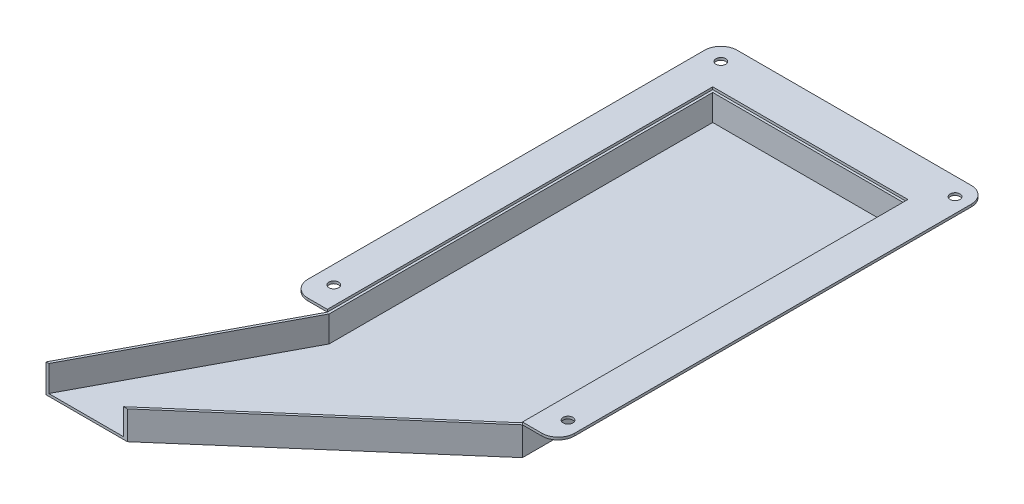
ISO-10303-21;
HEADER;
FILE_DESCRIPTION(('STEP AP214'),'2;1');
FILE_NAME('part.step','',(''),(''),'','','');
FILE_SCHEMA(('AUTOMOTIVE_DESIGN { 1 0 10303 214 1 1 1 1 }'));
ENDSEC;
DATA;
#1=APPLICATION_CONTEXT('core data for automotive mechanical design processes');
#2=APPLICATION_PROTOCOL_DEFINITION('international standard','automotive_design',2000,#1);
#3=PRODUCT_CONTEXT('',#1,'mechanical');
#4=PRODUCT('Part','Part','',(#3));
#5=PRODUCT_RELATED_PRODUCT_CATEGORY('part','',(#4));
#6=PRODUCT_DEFINITION_FORMATION('','',#4);
#7=PRODUCT_DEFINITION_CONTEXT('part definition',#1,'design');
#8=PRODUCT_DEFINITION('design','',#6,#7);
#9=PRODUCT_DEFINITION_SHAPE('','',#8);
#10=(LENGTH_UNIT() NAMED_UNIT(*) SI_UNIT(.MILLI.,.METRE.));
#11=(NAMED_UNIT(*) PLANE_ANGLE_UNIT() SI_UNIT($,.RADIAN.));
#12=(NAMED_UNIT(*) SI_UNIT($,.STERADIAN.) SOLID_ANGLE_UNIT());
#13=UNCERTAINTY_MEASURE_WITH_UNIT(LENGTH_MEASURE(1.E-05),#10,'distance_accuracy_value','');
#14=(GEOMETRIC_REPRESENTATION_CONTEXT(3) GLOBAL_UNCERTAINTY_ASSIGNED_CONTEXT((#13)) GLOBAL_UNIT_ASSIGNED_CONTEXT((#10,
#11,#12)) REPRESENTATION_CONTEXT('',''));
#15=CARTESIAN_POINT('',(0.,0.,0.));
#16=DIRECTION('',(0.,0.,1.));
#17=DIRECTION('',(1.,0.,0.));
#18=AXIS2_PLACEMENT_3D('',#15,#16,#17);
#19=CARTESIAN_POINT('',(0.,19.,0.));
#20=DIRECTION('',(0.,1.,0.));
#21=DIRECTION('',(0.,0.,1.));
#22=AXIS2_PLACEMENT_3D('',#19,#20,#21);
#23=PLANE('',#22);
#24=CARTESIAN_POINT('',(-11.,19.,-15.));
#25=DIRECTION('',(0.,1.,0.));
#26=DIRECTION('',(0.,0.,1.));
#27=AXIS2_PLACEMENT_3D('',#24,#25,#26);
#28=CIRCLE('',#27,3.);
#29=CARTESIAN_POINT('',(-11.,19.,-12.));
#30=VERTEX_POINT('',#29);
#31=EDGE_CURVE('E271',#30,#30,#28,.T.);
#32=ORIENTED_EDGE('',*,*,#31,.F.);
#33=EDGE_LOOP('',(#32));
#34=FACE_BOUND('',#33,.T.);
#35=CARTESIAN_POINT('',(-11.,19.,-253.));
#36=DIRECTION('',(0.,1.,0.));
#37=DIRECTION('',(0.,0.,1.));
#38=AXIS2_PLACEMENT_3D('',#35,#36,#37);
#39=CIRCLE('',#38,3.);
#40=CARTESIAN_POINT('',(-11.,19.,-250.));
#41=VERTEX_POINT('',#40);
#42=EDGE_CURVE('E179',#41,#41,#39,.T.);
#43=ORIENTED_EDGE('',*,*,#42,.F.);
#44=EDGE_LOOP('',(#43));
#45=FACE_BOUND('',#44,.T.);
#46=DIRECTION('',(-1.,0.,0.));
#47=VECTOR('',#46,1.);
#48=CARTESIAN_POINT('',(-22.,19.,-264.));
#49=LINE('',#48,#47);
#50=CARTESIAN_POINT('',(132.,19.,-264.));
#51=VERTEX_POINT('',#50);
#52=CARTESIAN_POINT('',(-12.,19.,-264.));
#53=VERTEX_POINT('',#52);
#54=EDGE_CURVE('E173',#51,#53,#49,.T.);
#55=ORIENTED_EDGE('',*,*,#54,.T.);
#56=CARTESIAN_POINT('',(-12.,19.,-254.));
#57=DIRECTION('',(0.,1.,0.));
#58=DIRECTION('',(0.,0.,1.));
#59=AXIS2_PLACEMENT_3D('',#56,#57,#58);
#60=CIRCLE('',#59,10.);
#61=CARTESIAN_POINT('',(-22.,19.,-254.));
#62=VERTEX_POINT('',#61);
#63=EDGE_CURVE('E222',#53,#62,#60,.T.);
#64=ORIENTED_EDGE('',*,*,#63,.T.);
#65=DIRECTION('',(0.,0.,1.));
#66=VECTOR('',#65,1.);
#67=CARTESIAN_POINT('',(-22.,19.,-264.));
#68=LINE('',#67,#66);
#69=CARTESIAN_POINT('',(-22.,19.,-10.));
#70=VERTEX_POINT('',#69);
#71=EDGE_CURVE('E147',#62,#70,#68,.T.);
#72=ORIENTED_EDGE('',*,*,#71,.T.);
#73=CARTESIAN_POINT('',(-12.,19.,-10.));
#74=DIRECTION('',(0.,1.,0.));
#75=DIRECTION('',(0.,0.,1.));
#76=AXIS2_PLACEMENT_3D('',#73,#74,#75);
#77=CIRCLE('',#76,10.);
#78=CARTESIAN_POINT('',(-12.,19.,0.));
#79=VERTEX_POINT('',#78);
#80=EDGE_CURVE('E144',#70,#79,#77,.T.);
#81=ORIENTED_EDGE('',*,*,#80,.T.);
#82=DIRECTION('',(1.,0.,0.));
#83=VECTOR('',#82,1.);
#84=CARTESIAN_POINT('',(-22.,19.,0.));
#85=LINE('',#84,#83);
#86=CARTESIAN_POINT('',(0.,19.,0.));
#87=VERTEX_POINT('',#86);
#88=EDGE_CURVE('E135',#79,#87,#85,.T.);
#89=ORIENTED_EDGE('',*,*,#88,.T.);
#90=DIRECTION('',(0.,0.,-1.));
#91=VECTOR('',#90,1.);
#92=CARTESIAN_POINT('',(0.,19.,-237.));
#93=LINE('',#92,#91);
#94=CARTESIAN_POINT('',(0.,19.,-237.));
#95=VERTEX_POINT('',#94);
#96=EDGE_CURVE('E140',#87,#95,#93,.T.);
#97=ORIENTED_EDGE('',*,*,#96,.T.);
#98=DIRECTION('',(1.,0.,0.));
#99=VECTOR('',#98,1.);
#100=CARTESIAN_POINT('',(120.,19.,-237.));
#101=LINE('',#100,#99);
#102=CARTESIAN_POINT('',(120.,19.,-237.));
#103=VERTEX_POINT('',#102);
#104=EDGE_CURVE('E162',#95,#103,#101,.T.);
#105=ORIENTED_EDGE('',*,*,#104,.T.);
#106=DIRECTION('',(0.,0.,1.));
#107=VECTOR('',#106,1.);
#108=CARTESIAN_POINT('',(120.,19.,0.));
#109=LINE('',#108,#107);
#110=CARTESIAN_POINT('',(120.,19.,0.));
#111=VERTEX_POINT('',#110);
#112=EDGE_CURVE('E164',#103,#111,#109,.T.);
#113=ORIENTED_EDGE('',*,*,#112,.T.);
#114=DIRECTION('',(1.,0.,0.));
#115=VECTOR('',#114,1.);
#116=CARTESIAN_POINT('',(142.,19.,0.));
#117=LINE('',#116,#115);
#118=CARTESIAN_POINT('',(132.,19.,0.));
#119=VERTEX_POINT('',#118);
#120=EDGE_CURVE('E169',#111,#119,#117,.T.);
#121=ORIENTED_EDGE('',*,*,#120,.T.);
#122=CARTESIAN_POINT('',(132.,19.,-10.));
#123=DIRECTION('',(0.,1.,0.));
#124=DIRECTION('',(0.,0.,1.));
#125=AXIS2_PLACEMENT_3D('',#122,#123,#124);
#126=CIRCLE('',#125,10.);
#127=CARTESIAN_POINT('',(142.,19.,-10.));
#128=VERTEX_POINT('',#127);
#129=EDGE_CURVE('E68',#119,#128,#126,.T.);
#130=ORIENTED_EDGE('',*,*,#129,.T.);
#131=DIRECTION('',(0.,0.,-1.));
#132=VECTOR('',#131,1.);
#133=CARTESIAN_POINT('',(142.,19.,-264.));
#134=LINE('',#133,#132);
#135=CARTESIAN_POINT('',(142.,19.,-254.));
#136=VERTEX_POINT('',#135);
#137=EDGE_CURVE('E171',#128,#136,#134,.T.);
#138=ORIENTED_EDGE('',*,*,#137,.T.);
#139=CARTESIAN_POINT('',(132.,19.,-254.));
#140=DIRECTION('',(0.,1.,0.));
#141=DIRECTION('',(0.,0.,1.));
#142=AXIS2_PLACEMENT_3D('',#139,#140,#141);
#143=CIRCLE('',#142,10.);
#144=EDGE_CURVE('E220',#136,#51,#143,.T.);
#145=ORIENTED_EDGE('',*,*,#144,.T.);
#146=EDGE_LOOP('',(#55,#64,#72,#81,#89,#97,#105,#113,#121,#130,#138,#145));
#147=FACE_BOUND('',#146,.T.);
#148=CARTESIAN_POINT('',(133.,19.,-253.));
#149=DIRECTION('',(0.,1.,0.));
#150=DIRECTION('',(0.,0.,1.));
#151=AXIS2_PLACEMENT_3D('',#148,#149,#150);
#152=CIRCLE('',#151,2.99999999999999);
#153=CARTESIAN_POINT('',(133.,19.,-250.));
#154=VERTEX_POINT('',#153);
#155=EDGE_CURVE('E265',#154,#154,#152,.T.);
#156=ORIENTED_EDGE('',*,*,#155,.F.);
#157=EDGE_LOOP('',(#156));
#158=FACE_BOUND('',#157,.T.);
#159=CARTESIAN_POINT('',(133.,19.,-15.));
#160=DIRECTION('',(0.,1.,0.));
#161=DIRECTION('',(0.,0.,1.));
#162=AXIS2_PLACEMENT_3D('',#159,#160,#161);
#163=CIRCLE('',#162,2.99999999999999);
#164=CARTESIAN_POINT('',(133.,19.,-12.));
#165=VERTEX_POINT('',#164);
#166=EDGE_CURVE('E277',#165,#165,#163,.T.);
#167=ORIENTED_EDGE('',*,*,#166,.F.);
#168=EDGE_LOOP('',(#167));
#169=FACE_BOUND('',#168,.T.);
#170=ADVANCED_FACE('F46',(#34,#45,#147,#158,#169),#23,.T.);
#171=CARTESIAN_POINT('',(0.,17.5,0.));
#172=DIRECTION('',(0.,1.,0.));
#173=DIRECTION('',(0.,0.,1.));
#174=AXIS2_PLACEMENT_3D('',#171,#172,#173);
#175=PLANE('',#174);
#176=DIRECTION('',(0.,0.,1.));
#177=VECTOR('',#176,1.);
#178=CARTESIAN_POINT('',(-22.,17.5,-264.));
#179=LINE('',#178,#177);
#180=CARTESIAN_POINT('',(-22.,17.5,-254.));
#181=VERTEX_POINT('',#180);
#182=CARTESIAN_POINT('',(-22.,17.5,-10.));
#183=VERTEX_POINT('',#182);
#184=EDGE_CURVE('E176',#181,#183,#179,.T.);
#185=ORIENTED_EDGE('',*,*,#184,.F.);
#186=CARTESIAN_POINT('',(-12.,17.5,-254.));
#187=DIRECTION('',(0.,1.,0.));
#188=DIRECTION('',(0.,0.,1.));
#189=AXIS2_PLACEMENT_3D('',#186,#187,#188);
#190=CIRCLE('',#189,10.);
#191=CARTESIAN_POINT('',(-12.,17.5,-264.));
#192=VERTEX_POINT('',#191);
#193=EDGE_CURVE('E211',#181,#192,#190,.F.);
#194=ORIENTED_EDGE('',*,*,#193,.T.);
#195=DIRECTION('',(-1.,0.,0.));
#196=VECTOR('',#195,1.);
#197=CARTESIAN_POINT('',(-22.,17.5,-264.));
#198=LINE('',#197,#196);
#199=CARTESIAN_POINT('',(132.,17.5,-264.));
#200=VERTEX_POINT('',#199);
#201=EDGE_CURVE('E192',#200,#192,#198,.T.);
#202=ORIENTED_EDGE('',*,*,#201,.F.);
#203=CARTESIAN_POINT('',(132.,17.5,-254.));
#204=DIRECTION('',(0.,1.,0.));
#205=DIRECTION('',(0.,0.,1.));
#206=AXIS2_PLACEMENT_3D('',#203,#204,#205);
#207=CIRCLE('',#206,10.);
#208=CARTESIAN_POINT('',(142.,17.5,-254.));
#209=VERTEX_POINT('',#208);
#210=EDGE_CURVE('E209',#200,#209,#207,.F.);
#211=ORIENTED_EDGE('',*,*,#210,.T.);
#212=DIRECTION('',(0.,0.,-1.));
#213=VECTOR('',#212,1.);
#214=CARTESIAN_POINT('',(142.,17.5,-264.));
#215=LINE('',#214,#213);
#216=CARTESIAN_POINT('',(142.,17.5,-10.));
#217=VERTEX_POINT('',#216);
#218=EDGE_CURVE('E190',#217,#209,#215,.T.);
#219=ORIENTED_EDGE('',*,*,#218,.F.);
#220=CARTESIAN_POINT('',(132.,17.5,-10.));
#221=DIRECTION('',(0.,1.,0.));
#222=DIRECTION('',(0.,0.,1.));
#223=AXIS2_PLACEMENT_3D('',#220,#221,#222);
#224=CIRCLE('',#223,10.);
#225=CARTESIAN_POINT('',(132.,17.5,0.));
#226=VERTEX_POINT('',#225);
#227=EDGE_CURVE('E207',#217,#226,#224,.F.);
#228=ORIENTED_EDGE('',*,*,#227,.T.);
#229=DIRECTION('',(1.,0.,0.));
#230=VECTOR('',#229,1.);
#231=CARTESIAN_POINT('',(142.,17.5,0.));
#232=LINE('',#231,#230);
#233=CARTESIAN_POINT('',(120.,17.5,0.));
#234=VERTEX_POINT('',#233);
#235=EDGE_CURVE('E187',#234,#226,#232,.T.);
#236=ORIENTED_EDGE('',*,*,#235,.F.);
#237=DIRECTION('',(0.,0.,1.));
#238=VECTOR('',#237,1.);
#239=CARTESIAN_POINT('',(120.,17.5,0.));
#240=LINE('',#239,#238);
#241=CARTESIAN_POINT('',(120.,17.5,-237.));
#242=VERTEX_POINT('',#241);
#243=EDGE_CURVE('E185',#242,#234,#240,.T.);
#244=ORIENTED_EDGE('',*,*,#243,.F.);
#245=DIRECTION('',(1.,0.,0.));
#246=VECTOR('',#245,1.);
#247=CARTESIAN_POINT('',(120.,17.5,-237.));
#248=LINE('',#247,#246);
#249=CARTESIAN_POINT('',(0.,17.5,-237.));
#250=VERTEX_POINT('',#249);
#251=EDGE_CURVE('E183',#250,#242,#248,.T.);
#252=ORIENTED_EDGE('',*,*,#251,.F.);
#253=DIRECTION('',(0.,0.,-1.));
#254=VECTOR('',#253,1.);
#255=CARTESIAN_POINT('',(0.,17.5,-237.));
#256=LINE('',#255,#254);
#257=CARTESIAN_POINT('',(0.,17.5,0.));
#258=VERTEX_POINT('',#257);
#259=EDGE_CURVE('E181',#258,#250,#256,.T.);
#260=ORIENTED_EDGE('',*,*,#259,.F.);
#261=DIRECTION('',(1.,0.,0.));
#262=VECTOR('',#261,1.);
#263=CARTESIAN_POINT('',(-22.,17.5,0.));
#264=LINE('',#263,#262);
#265=CARTESIAN_POINT('',(-12.,17.5,0.));
#266=VERTEX_POINT('',#265);
#267=EDGE_CURVE('E153',#266,#258,#264,.T.);
#268=ORIENTED_EDGE('',*,*,#267,.F.);
#269=CARTESIAN_POINT('',(-12.,17.5,-10.));
#270=DIRECTION('',(0.,1.,0.));
#271=DIRECTION('',(0.,0.,1.));
#272=AXIS2_PLACEMENT_3D('',#269,#270,#271);
#273=CIRCLE('',#272,10.);
#274=EDGE_CURVE('E205',#266,#183,#273,.F.);
#275=ORIENTED_EDGE('',*,*,#274,.T.);
#276=EDGE_LOOP('',(#185,#194,#202,#211,#219,#228,#236,#244,#252,#260,#268,#275));
#277=FACE_BOUND('',#276,.T.);
#278=CARTESIAN_POINT('',(-11.,17.5,-253.));
#279=DIRECTION('',(0.,1.,0.));
#280=DIRECTION('',(0.,0.,1.));
#281=AXIS2_PLACEMENT_3D('',#278,#279,#280);
#282=CIRCLE('',#281,3.);
#283=CARTESIAN_POINT('',(-11.,17.5,-250.));
#284=VERTEX_POINT('',#283);
#285=EDGE_CURVE('E262',#284,#284,#282,.T.);
#286=ORIENTED_EDGE('',*,*,#285,.T.);
#287=EDGE_LOOP('',(#286));
#288=FACE_BOUND('',#287,.T.);
#289=CARTESIAN_POINT('',(133.,17.5,-253.));
#290=DIRECTION('',(0.,1.,0.));
#291=DIRECTION('',(0.,0.,1.));
#292=AXIS2_PLACEMENT_3D('',#289,#290,#291);
#293=CIRCLE('',#292,2.99999999999999);
#294=CARTESIAN_POINT('',(133.,17.5,-250.));
#295=VERTEX_POINT('',#294);
#296=EDGE_CURVE('E268',#295,#295,#293,.T.);
#297=ORIENTED_EDGE('',*,*,#296,.T.);
#298=EDGE_LOOP('',(#297));
#299=FACE_BOUND('',#298,.T.);
#300=CARTESIAN_POINT('',(-11.,17.5,-15.));
#301=DIRECTION('',(0.,1.,0.));
#302=DIRECTION('',(0.,0.,1.));
#303=AXIS2_PLACEMENT_3D('',#300,#301,#302);
#304=CIRCLE('',#303,3.);
#305=CARTESIAN_POINT('',(-11.,17.5,-12.));
#306=VERTEX_POINT('',#305);
#307=EDGE_CURVE('E274',#306,#306,#304,.T.);
#308=ORIENTED_EDGE('',*,*,#307,.T.);
#309=EDGE_LOOP('',(#308));
#310=FACE_BOUND('',#309,.T.);
#311=CARTESIAN_POINT('',(133.,17.5,-15.));
#312=DIRECTION('',(0.,1.,0.));
#313=DIRECTION('',(0.,0.,1.));
#314=AXIS2_PLACEMENT_3D('',#311,#312,#313);
#315=CIRCLE('',#314,2.99999999999999);
#316=CARTESIAN_POINT('',(133.,17.5,-12.));
#317=VERTEX_POINT('',#316);
#318=EDGE_CURVE('E280',#317,#317,#315,.T.);
#319=ORIENTED_EDGE('',*,*,#318,.T.);
#320=EDGE_LOOP('',(#319));
#321=FACE_BOUND('',#320,.T.);
#322=ADVANCED_FACE('F241',(#277,#288,#299,#310,#321),#175,.F.);
#323=CARTESIAN_POINT('',(-22.,19.,-264.));
#324=DIRECTION('',(1.,0.,0.));
#325=DIRECTION('',(0.,0.,-1.));
#326=AXIS2_PLACEMENT_3D('',#323,#324,#325);
#327=PLANE('',#326);
#328=ORIENTED_EDGE('',*,*,#71,.F.);
#329=DIRECTION('',(0.,-1.,0.));
#330=VECTOR('',#329,1.);
#331=CARTESIAN_POINT('',(-22.,19.,-254.));
#332=LINE('',#331,#330);
#333=EDGE_CURVE('E202',#62,#181,#332,.T.);
#334=ORIENTED_EDGE('',*,*,#333,.T.);
#335=ORIENTED_EDGE('',*,*,#184,.T.);
#336=DIRECTION('',(0.,-1.,0.));
#337=VECTOR('',#336,1.);
#338=CARTESIAN_POINT('',(-22.,19.,-10.));
#339=LINE('',#338,#337);
#340=EDGE_CURVE('E156',#183,#70,#339,.F.);
#341=ORIENTED_EDGE('',*,*,#340,.T.);
#342=EDGE_LOOP('',(#328,#334,#335,#341));
#343=FACE_BOUND('',#342,.T.);
#344=ADVANCED_FACE('F258',(#343),#327,.F.);
#345=CARTESIAN_POINT('',(-22.,19.,0.));
#346=DIRECTION('',(0.,0.,-1.));
#347=DIRECTION('',(-1.,0.,0.));
#348=AXIS2_PLACEMENT_3D('',#345,#346,#347);
#349=PLANE('',#348);
#350=ORIENTED_EDGE('',*,*,#88,.F.);
#351=DIRECTION('',(0.,-1.,0.));
#352=VECTOR('',#351,1.);
#353=CARTESIAN_POINT('',(-12.,19.,0.));
#354=LINE('',#353,#352);
#355=EDGE_CURVE('E12',#79,#266,#354,.T.);
#356=ORIENTED_EDGE('',*,*,#355,.T.);
#357=ORIENTED_EDGE('',*,*,#267,.T.);
#358=DIRECTION('',(0.,-1.,0.));
#359=VECTOR('',#358,1.);
#360=CARTESIAN_POINT('',(0.,19.,0.));
#361=LINE('',#360,#359);
#362=EDGE_CURVE('E150',#87,#258,#361,.T.);
#363=ORIENTED_EDGE('',*,*,#362,.F.);
#364=EDGE_LOOP('',(#350,#356,#357,#363));
#365=FACE_BOUND('',#364,.T.);
#366=ADVANCED_FACE('F151',(#365),#349,.F.);
#367=CARTESIAN_POINT('',(0.,19.,-237.));
#368=DIRECTION('',(-1.,0.,0.));
#369=DIRECTION('',(0.,0.,1.));
#370=AXIS2_PLACEMENT_3D('',#367,#368,#369);
#371=PLANE('',#370);
#372=ORIENTED_EDGE('',*,*,#259,.T.);
#373=DIRECTION('',(0.,-1.,0.));
#374=VECTOR('',#373,1.);
#375=CARTESIAN_POINT('',(0.,19.,-237.));
#376=LINE('',#375,#374);
#377=EDGE_CURVE('E157',#95,#250,#376,.T.);
#378=ORIENTED_EDGE('',*,*,#377,.F.);
#379=ORIENTED_EDGE('',*,*,#96,.F.);
#380=ORIENTED_EDGE('',*,*,#362,.T.);
#381=EDGE_LOOP('',(#372,#378,#379,#380));
#382=FACE_BOUND('',#381,.T.);
#383=ADVANCED_FACE('F159',(#382),#371,.F.);
#384=CARTESIAN_POINT('',(120.,19.,-237.));
#385=DIRECTION('',(0.,0.,-1.));
#386=DIRECTION('',(-1.,0.,0.));
#387=AXIS2_PLACEMENT_3D('',#384,#385,#386);
#388=PLANE('',#387);
#389=ORIENTED_EDGE('',*,*,#251,.T.);
#390=DIRECTION('',(0.,-1.,0.));
#391=VECTOR('',#390,1.);
#392=CARTESIAN_POINT('',(120.,19.,-237.));
#393=LINE('',#392,#391);
#394=EDGE_CURVE('E197',#103,#242,#393,.T.);
#395=ORIENTED_EDGE('',*,*,#394,.F.);
#396=ORIENTED_EDGE('',*,*,#104,.F.);
#397=ORIENTED_EDGE('',*,*,#377,.T.);
#398=EDGE_LOOP('',(#389,#395,#396,#397));
#399=FACE_BOUND('',#398,.T.);
#400=ADVANCED_FACE('F311',(#399),#388,.F.);
#401=CARTESIAN_POINT('',(120.,19.,0.));
#402=DIRECTION('',(1.,0.,0.));
#403=DIRECTION('',(0.,0.,-1.));
#404=AXIS2_PLACEMENT_3D('',#401,#402,#403);
#405=PLANE('',#404);
#406=ORIENTED_EDGE('',*,*,#243,.T.);
#407=DIRECTION('',(0.,-1.,0.));
#408=VECTOR('',#407,1.);
#409=CARTESIAN_POINT('',(120.,19.,0.));
#410=LINE('',#409,#408);
#411=EDGE_CURVE('E175',#111,#234,#410,.T.);
#412=ORIENTED_EDGE('',*,*,#411,.F.);
#413=ORIENTED_EDGE('',*,*,#112,.F.);
#414=ORIENTED_EDGE('',*,*,#394,.T.);
#415=EDGE_LOOP('',(#406,#412,#413,#414));
#416=FACE_BOUND('',#415,.T.);
#417=ADVANCED_FACE('F308',(#416),#405,.F.);
#418=CARTESIAN_POINT('',(142.,19.,0.));
#419=DIRECTION('',(0.,0.,-1.));
#420=DIRECTION('',(-1.,0.,0.));
#421=AXIS2_PLACEMENT_3D('',#418,#419,#420);
#422=PLANE('',#421);
#423=ORIENTED_EDGE('',*,*,#235,.T.);
#424=DIRECTION('',(0.,-1.,0.));
#425=VECTOR('',#424,1.);
#426=CARTESIAN_POINT('',(132.,19.,0.));
#427=LINE('',#426,#425);
#428=EDGE_CURVE('E54',#226,#119,#427,.F.);
#429=ORIENTED_EDGE('',*,*,#428,.T.);
#430=ORIENTED_EDGE('',*,*,#120,.F.);
#431=ORIENTED_EDGE('',*,*,#411,.T.);
#432=EDGE_LOOP('',(#423,#429,#430,#431));
#433=FACE_BOUND('',#432,.T.);
#434=ADVANCED_FACE('F230',(#433),#422,.F.);
#435=CARTESIAN_POINT('',(142.,19.,-264.));
#436=DIRECTION('',(-1.,0.,0.));
#437=DIRECTION('',(0.,0.,1.));
#438=AXIS2_PLACEMENT_3D('',#435,#436,#437);
#439=PLANE('',#438);
#440=ORIENTED_EDGE('',*,*,#218,.T.);
#441=DIRECTION('',(0.,-1.,0.));
#442=VECTOR('',#441,1.);
#443=CARTESIAN_POINT('',(142.,19.,-254.));
#444=LINE('',#443,#442);
#445=EDGE_CURVE('E61',#209,#136,#444,.F.);
#446=ORIENTED_EDGE('',*,*,#445,.T.);
#447=ORIENTED_EDGE('',*,*,#137,.F.);
#448=DIRECTION('',(0.,-1.,0.));
#449=VECTOR('',#448,1.);
#450=CARTESIAN_POINT('',(142.,19.,-10.));
#451=LINE('',#450,#449);
#452=EDGE_CURVE('E224',#128,#217,#451,.T.);
#453=ORIENTED_EDGE('',*,*,#452,.T.);
#454=EDGE_LOOP('',(#440,#446,#447,#453));
#455=FACE_BOUND('',#454,.T.);
#456=ADVANCED_FACE('F238',(#455),#439,.F.);
#457=CARTESIAN_POINT('',(-22.,19.,-264.));
#458=DIRECTION('',(0.,0.,1.));
#459=DIRECTION('',(1.,0.,0.));
#460=AXIS2_PLACEMENT_3D('',#457,#458,#459);
#461=PLANE('',#460);
#462=ORIENTED_EDGE('',*,*,#201,.T.);
#463=DIRECTION('',(0.,-1.,0.));
#464=VECTOR('',#463,1.);
#465=CARTESIAN_POINT('',(-12.,19.,-264.));
#466=LINE('',#465,#464);
#467=EDGE_CURVE('E216',#192,#53,#466,.F.);
#468=ORIENTED_EDGE('',*,*,#467,.T.);
#469=ORIENTED_EDGE('',*,*,#54,.F.);
#470=DIRECTION('',(0.,-1.,0.));
#471=VECTOR('',#470,1.);
#472=CARTESIAN_POINT('',(132.,19.,-264.));
#473=LINE('',#472,#471);
#474=EDGE_CURVE('E213',#51,#200,#473,.T.);
#475=ORIENTED_EDGE('',*,*,#474,.T.);
#476=EDGE_LOOP('',(#462,#468,#469,#475));
#477=FACE_BOUND('',#476,.T.);
#478=ADVANCED_FACE('F250',(#477),#461,.F.);
#479=CARTESIAN_POINT('',(-11.,19.,-253.));
#480=DIRECTION('',(0.,-1.,0.));
#481=DIRECTION('',(0.,0.,-1.));
#482=AXIS2_PLACEMENT_3D('',#479,#480,#481);
#483=CYLINDRICAL_SURFACE('',#482,3.);
#484=ORIENTED_EDGE('',*,*,#42,.T.);
#485=EDGE_LOOP('',(#484));
#486=FACE_BOUND('',#485,.T.);
#487=ORIENTED_EDGE('',*,*,#285,.F.);
#488=EDGE_LOOP('',(#487));
#489=FACE_BOUND('',#488,.T.);
#490=ADVANCED_FACE('F299',(#486,#489),#483,.F.);
#491=CARTESIAN_POINT('',(133.,19.,-253.));
#492=DIRECTION('',(0.,-1.,0.));
#493=DIRECTION('',(0.,0.,-1.));
#494=AXIS2_PLACEMENT_3D('',#491,#492,#493);
#495=CYLINDRICAL_SURFACE('',#494,2.99999999999999);
#496=ORIENTED_EDGE('',*,*,#155,.T.);
#497=EDGE_LOOP('',(#496));
#498=FACE_BOUND('',#497,.T.);
#499=ORIENTED_EDGE('',*,*,#296,.F.);
#500=EDGE_LOOP('',(#499));
#501=FACE_BOUND('',#500,.T.);
#502=ADVANCED_FACE('F409',(#498,#501),#495,.F.);
#503=CARTESIAN_POINT('',(-11.,19.,-15.));
#504=DIRECTION('',(0.,-1.,0.));
#505=DIRECTION('',(0.,0.,-1.));
#506=AXIS2_PLACEMENT_3D('',#503,#504,#505);
#507=CYLINDRICAL_SURFACE('',#506,3.);
#508=ORIENTED_EDGE('',*,*,#31,.T.);
#509=EDGE_LOOP('',(#508));
#510=FACE_BOUND('',#509,.T.);
#511=ORIENTED_EDGE('',*,*,#307,.F.);
#512=EDGE_LOOP('',(#511));
#513=FACE_BOUND('',#512,.T.);
#514=ADVANCED_FACE('F400',(#510,#513),#507,.F.);
#515=CARTESIAN_POINT('',(133.,19.,-15.));
#516=DIRECTION('',(0.,-1.,0.));
#517=DIRECTION('',(0.,0.,-1.));
#518=AXIS2_PLACEMENT_3D('',#515,#516,#517);
#519=CYLINDRICAL_SURFACE('',#518,2.99999999999999);
#520=ORIENTED_EDGE('',*,*,#166,.T.);
#521=EDGE_LOOP('',(#520));
#522=FACE_BOUND('',#521,.T.);
#523=ORIENTED_EDGE('',*,*,#318,.F.);
#524=EDGE_LOOP('',(#523));
#525=FACE_BOUND('',#524,.T.);
#526=ADVANCED_FACE('F286',(#522,#525),#519,.F.);
#527=CARTESIAN_POINT('',(-12.,19.,-254.));
#528=DIRECTION('',(0.,-1.,0.));
#529=DIRECTION('',(0.,0.,-1.));
#530=AXIS2_PLACEMENT_3D('',#527,#528,#529);
#531=CYLINDRICAL_SURFACE('',#530,10.);
#532=ORIENTED_EDGE('',*,*,#63,.F.);
#533=ORIENTED_EDGE('',*,*,#467,.F.);
#534=ORIENTED_EDGE('',*,*,#193,.F.);
#535=ORIENTED_EDGE('',*,*,#333,.F.);
#536=EDGE_LOOP('',(#532,#533,#534,#535));
#537=FACE_BOUND('',#536,.T.);
#538=ADVANCED_FACE('F256',(#537),#531,.T.);
#539=CARTESIAN_POINT('',(132.,19.,-254.));
#540=DIRECTION('',(0.,-1.,0.));
#541=DIRECTION('',(0.,0.,-1.));
#542=AXIS2_PLACEMENT_3D('',#539,#540,#541);
#543=CYLINDRICAL_SURFACE('',#542,10.);
#544=ORIENTED_EDGE('',*,*,#144,.F.);
#545=ORIENTED_EDGE('',*,*,#445,.F.);
#546=ORIENTED_EDGE('',*,*,#210,.F.);
#547=ORIENTED_EDGE('',*,*,#474,.F.);
#548=EDGE_LOOP('',(#544,#545,#546,#547));
#549=FACE_BOUND('',#548,.T.);
#550=ADVANCED_FACE('F247',(#549),#543,.T.);
#551=CARTESIAN_POINT('',(132.,19.,-10.));
#552=DIRECTION('',(0.,-1.,0.));
#553=DIRECTION('',(0.,0.,-1.));
#554=AXIS2_PLACEMENT_3D('',#551,#552,#553);
#555=CYLINDRICAL_SURFACE('',#554,10.);
#556=ORIENTED_EDGE('',*,*,#129,.F.);
#557=ORIENTED_EDGE('',*,*,#428,.F.);
#558=ORIENTED_EDGE('',*,*,#227,.F.);
#559=ORIENTED_EDGE('',*,*,#452,.F.);
#560=EDGE_LOOP('',(#556,#557,#558,#559));
#561=FACE_BOUND('',#560,.T.);
#562=ADVANCED_FACE('F236',(#561),#555,.T.);
#563=CARTESIAN_POINT('',(-12.,19.,-10.));
#564=DIRECTION('',(0.,-1.,0.));
#565=DIRECTION('',(0.,0.,-1.));
#566=AXIS2_PLACEMENT_3D('',#563,#564,#565);
#567=CYLINDRICAL_SURFACE('',#566,10.);
#568=ORIENTED_EDGE('',*,*,#80,.F.);
#569=ORIENTED_EDGE('',*,*,#340,.F.);
#570=ORIENTED_EDGE('',*,*,#274,.F.);
#571=ORIENTED_EDGE('',*,*,#355,.F.);
#572=EDGE_LOOP('',(#568,#569,#570,#571));
#573=FACE_BOUND('',#572,.T.);
#574=ADVANCED_FACE('F48',(#573),#567,.T.);
#575=CLOSED_SHELL('',(#170,#322,#344,#366,#383,#400,#417,#434,#456,#478,#490,#502,#514,#526,
#538,#550,#562,#574));
#576=MANIFOLD_SOLID_BREP('B2',#575);
#577=CARTESIAN_POINT('',(0.,1.5,0.));
#578=DIRECTION('',(0.,-1.,0.));
#579=DIRECTION('',(0.,0.,-1.));
#580=AXIS2_PLACEMENT_3D('',#577,#578,#579);
#581=PLANE('',#580);
#582=DIRECTION('',(-0.754730494894137,0.,0.656034968638754));
#583=VECTOR('',#582,1.);
#584=CARTESIAN_POINT('',(-10.560799767156,1.5,111.5));
#585=LINE('',#584,#583);
#586=CARTESIAN_POINT('',(118.5,1.5,-0.683618259143297));
#587=VERTEX_POINT('',#586);
#588=CARTESIAN_POINT('',(-12.28646348397,1.5,113.));
#589=VERTEX_POINT('',#588);
#590=EDGE_CURVE('E476',#587,#589,#585,.T.);
#591=ORIENTED_EDGE('',*,*,#590,.F.);
#592=DIRECTION('',(0.,0.,1.));
#593=VECTOR('',#592,1.);
#594=CARTESIAN_POINT('',(118.5,1.5,-235.5));
#595=LINE('',#594,#593);
#596=CARTESIAN_POINT('',(118.5,1.5,-235.5));
#597=VERTEX_POINT('',#596);
#598=EDGE_CURVE('E480',#597,#587,#595,.T.);
#599=ORIENTED_EDGE('',*,*,#598,.F.);
#600=DIRECTION('',(1.,0.,0.));
#601=VECTOR('',#600,1.);
#602=CARTESIAN_POINT('',(1.5,1.5,-235.5));
#603=LINE('',#602,#601);
#604=CARTESIAN_POINT('',(1.5,1.5,-235.5));
#605=VERTEX_POINT('',#604);
#606=EDGE_CURVE('E603',#605,#597,#603,.T.);
#607=ORIENTED_EDGE('',*,*,#606,.F.);
#608=DIRECTION('',(0.,0.,-1.));
#609=VECTOR('',#608,1.);
#610=CARTESIAN_POINT('',(1.5,1.5,0.373534820820325));
#611=LINE('',#610,#609);
#612=CARTESIAN_POINT('',(1.5,1.5,0.373534820820325));
#613=VERTEX_POINT('',#612);
#614=EDGE_CURVE('E600',#613,#605,#611,.T.);
#615=ORIENTED_EDGE('',*,*,#614,.F.);
#616=DIRECTION('',(0.468964724171833,0.,-0.883216897190286));
#617=VECTOR('',#616,1.);
#618=CARTESIAN_POINT('',(-57.5052027500069,1.5,111.5));
#619=LINE('',#618,#617);
#620=CARTESIAN_POINT('',(-58.301662926998,1.5,113.));
#621=VERTEX_POINT('',#620);
#622=EDGE_CURVE('E597',#621,#613,#619,.T.);
#623=ORIENTED_EDGE('',*,*,#622,.F.);
#624=DIRECTION('',(1.,0.,0.));
#625=VECTOR('',#624,1.);
#626=CARTESIAN_POINT('',(-9.99999999999994,1.5,113.));
#627=LINE('',#626,#625);
#628=EDGE_CURVE('E560',#621,#589,#627,.T.);
#629=ORIENTED_EDGE('',*,*,#628,.T.);
#630=EDGE_LOOP('',(#591,#599,#607,#615,#623,#629));
#631=FACE_BOUND('',#630,.T.);
#632=ADVANCED_FACE('F461',(#631),#581,.F.);
#633=CARTESIAN_POINT('',(-60.,1.5,113.));
#634=DIRECTION('',(0.883216897190286,0.,0.468964724171833));
#635=DIRECTION('',(0.468964724171833,0.,-0.883216897190286));
#636=AXIS2_PLACEMENT_3D('',#633,#634,#635);
#637=PLANE('',#636);
#638=DIRECTION('',(-0.468964724171833,0.,0.883216897190286));
#639=VECTOR('',#638,1.);
#640=CARTESIAN_POINT('',(-60.,0.,113.));
#641=LINE('',#640,#639);
#642=CARTESIAN_POINT('',(0.,0.,0.));
#643=VERTEX_POINT('',#642);
#644=CARTESIAN_POINT('',(-60.,0.,113.));
#645=VERTEX_POINT('',#644);
#646=EDGE_CURVE('E623',#643,#645,#641,.T.);
#647=ORIENTED_EDGE('',*,*,#646,.T.);
#648=DIRECTION('',(0.,-1.,0.));
#649=VECTOR('',#648,1.);
#650=CARTESIAN_POINT('',(-60.,1.5,113.));
#651=LINE('',#650,#649);
#652=CARTESIAN_POINT('',(-60.,17.5,113.));
#653=VERTEX_POINT('',#652);
#654=EDGE_CURVE('E44',#653,#645,#651,.T.);
#655=ORIENTED_EDGE('',*,*,#654,.F.);
#656=DIRECTION('',(-0.468964724171833,0.,0.883216897190286));
#657=VECTOR('',#656,1.);
#658=CARTESIAN_POINT('',(-60.,17.5,113.));
#659=LINE('',#658,#657);
#660=CARTESIAN_POINT('',(0.,17.5,0.));
#661=VERTEX_POINT('',#660);
#662=EDGE_CURVE('E563',#661,#653,#659,.T.);
#663=ORIENTED_EDGE('',*,*,#662,.F.);
#664=DIRECTION('',(0.,-1.,0.));
#665=VECTOR('',#664,1.);
#666=CARTESIAN_POINT('',(0.,1.5,0.));
#667=LINE('',#666,#665);
#668=EDGE_CURVE('E548',#661,#643,#667,.T.);
#669=ORIENTED_EDGE('',*,*,#668,.T.);
#670=EDGE_LOOP('',(#647,#655,#663,#669));
#671=FACE_BOUND('',#670,.T.);
#672=ADVANCED_FACE('F463',(#671),#637,.F.);
#673=CARTESIAN_POINT('',(-9.99999999999994,1.5,113.));
#674=DIRECTION('',(0.,0.,-1.));
#675=DIRECTION('',(-1.,0.,0.));
#676=AXIS2_PLACEMENT_3D('',#673,#674,#675);
#677=PLANE('',#676);
#678=DIRECTION('',(1.,0.,0.));
#679=VECTOR('',#678,1.);
#680=CARTESIAN_POINT('',(-9.99999999999994,0.,113.));
#681=LINE('',#680,#679);
#682=CARTESIAN_POINT('',(-9.99999999999994,0.,113.));
#683=VERTEX_POINT('',#682);
#684=EDGE_CURVE('E626',#645,#683,#681,.T.);
#685=ORIENTED_EDGE('',*,*,#684,.T.);
#686=DIRECTION('',(0.,-1.,0.));
#687=VECTOR('',#686,1.);
#688=CARTESIAN_POINT('',(-9.99999999999994,1.5,113.));
#689=LINE('',#688,#687);
#690=CARTESIAN_POINT('',(-9.99999999999994,17.5,113.));
#691=VERTEX_POINT('',#690);
#692=EDGE_CURVE('E469',#691,#683,#689,.T.);
#693=ORIENTED_EDGE('',*,*,#692,.F.);
#694=DIRECTION('',(1.,0.,0.));
#695=VECTOR('',#694,1.);
#696=CARTESIAN_POINT('',(-12.2864634839701,17.5,113.));
#697=LINE('',#696,#695);
#698=CARTESIAN_POINT('',(-12.2864634839701,17.5,113.));
#699=VERTEX_POINT('',#698);
#700=EDGE_CURVE('E587',#699,#691,#697,.T.);
#701=ORIENTED_EDGE('',*,*,#700,.F.);
#702=DIRECTION('',(0.,-1.,0.));
#703=VECTOR('',#702,1.);
#704=CARTESIAN_POINT('',(-12.2864634839701,17.5,113.));
#705=LINE('',#704,#703);
#706=EDGE_CURVE('E596',#699,#589,#705,.T.);
#707=ORIENTED_EDGE('',*,*,#706,.T.);
#708=ORIENTED_EDGE('',*,*,#628,.F.);
#709=DIRECTION('',(0.,-1.,0.));
#710=VECTOR('',#709,1.);
#711=CARTESIAN_POINT('',(-58.301662926998,17.5,113.));
#712=LINE('',#711,#710);
#713=CARTESIAN_POINT('',(-58.301662926998,17.5,113.));
#714=VERTEX_POINT('',#713);
#715=EDGE_CURVE('E620',#714,#621,#712,.T.);
#716=ORIENTED_EDGE('',*,*,#715,.F.);
#717=DIRECTION('',(1.,0.,0.));
#718=VECTOR('',#717,1.);
#719=CARTESIAN_POINT('',(-60.,17.5,113.));
#720=LINE('',#719,#718);
#721=EDGE_CURVE('E566',#653,#714,#720,.T.);
#722=ORIENTED_EDGE('',*,*,#721,.F.);
#723=ORIENTED_EDGE('',*,*,#654,.T.);
#724=EDGE_LOOP('',(#685,#693,#701,#707,#708,#716,#722,#723));
#725=FACE_BOUND('',#724,.T.);
#726=ADVANCED_FACE('F670',(#725),#677,.F.);
#727=CARTESIAN_POINT('',(120.,1.5,0.));
#728=DIRECTION('',(-0.656034968638752,0.,-0.754730494894139));
#729=DIRECTION('',(-0.754730494894139,0.,0.656034968638752));
#730=AXIS2_PLACEMENT_3D('',#727,#728,#729);
#731=PLANE('',#730);
#732=DIRECTION('',(0.754730494894139,0.,-0.656034968638752));
#733=VECTOR('',#732,1.);
#734=CARTESIAN_POINT('',(120.,0.,0.));
#735=LINE('',#734,#733);
#736=CARTESIAN_POINT('',(120.,0.,0.));
#737=VERTEX_POINT('',#736);
#738=EDGE_CURVE('E628',#683,#737,#735,.T.);
#739=ORIENTED_EDGE('',*,*,#738,.T.);
#740=DIRECTION('',(0.,-1.,0.));
#741=VECTOR('',#740,1.);
#742=CARTESIAN_POINT('',(120.,1.5,0.));
#743=LINE('',#742,#741);
#744=CARTESIAN_POINT('',(120.,17.5,0.));
#745=VERTEX_POINT('',#744);
#746=EDGE_CURVE('E639',#745,#737,#743,.T.);
#747=ORIENTED_EDGE('',*,*,#746,.F.);
#748=DIRECTION('',(0.754730494894139,0.,-0.656034968638752));
#749=VECTOR('',#748,1.);
#750=CARTESIAN_POINT('',(120.,17.5,0.));
#751=LINE('',#750,#749);
#752=EDGE_CURVE('E590',#691,#745,#751,.T.);
#753=ORIENTED_EDGE('',*,*,#752,.F.);
#754=ORIENTED_EDGE('',*,*,#692,.T.);
#755=EDGE_LOOP('',(#739,#747,#753,#754));
#756=FACE_BOUND('',#755,.T.);
#757=ADVANCED_FACE('F645',(#756),#731,.F.);
#758=CARTESIAN_POINT('',(120.,1.5,-237.));
#759=DIRECTION('',(-1.,0.,0.));
#760=DIRECTION('',(0.,0.,1.));
#761=AXIS2_PLACEMENT_3D('',#758,#759,#760);
#762=PLANE('',#761);
#763=DIRECTION('',(0.,0.,-1.));
#764=VECTOR('',#763,1.);
#765=CARTESIAN_POINT('',(120.,0.,-237.));
#766=LINE('',#765,#764);
#767=CARTESIAN_POINT('',(120.,0.,-237.));
#768=VERTEX_POINT('',#767);
#769=EDGE_CURVE('E630',#737,#768,#766,.T.);
#770=ORIENTED_EDGE('',*,*,#769,.T.);
#771=DIRECTION('',(0.,-1.,0.));
#772=VECTOR('',#771,1.);
#773=CARTESIAN_POINT('',(120.,1.5,-237.));
#774=LINE('',#773,#772);
#775=CARTESIAN_POINT('',(120.,17.5,-237.));
#776=VERTEX_POINT('',#775);
#777=EDGE_CURVE('E636',#776,#768,#774,.T.);
#778=ORIENTED_EDGE('',*,*,#777,.F.);
#779=DIRECTION('',(0.,0.,-1.));
#780=VECTOR('',#779,1.);
#781=CARTESIAN_POINT('',(120.,17.5,-237.));
#782=LINE('',#781,#780);
#783=EDGE_CURVE('E593',#745,#776,#782,.T.);
#784=ORIENTED_EDGE('',*,*,#783,.F.);
#785=ORIENTED_EDGE('',*,*,#746,.T.);
#786=EDGE_LOOP('',(#770,#778,#784,#785));
#787=FACE_BOUND('',#786,.T.);
#788=ADVANCED_FACE('F653',(#787),#762,.F.);
#789=CARTESIAN_POINT('',(0.,1.5,-237.));
#790=DIRECTION('',(0.,0.,1.));
#791=DIRECTION('',(1.,0.,0.));
#792=AXIS2_PLACEMENT_3D('',#789,#790,#791);
#793=PLANE('',#792);
#794=DIRECTION('',(-1.,0.,0.));
#795=VECTOR('',#794,1.);
#796=CARTESIAN_POINT('',(0.,0.,-237.));
#797=LINE('',#796,#795);
#798=CARTESIAN_POINT('',(0.,0.,-237.));
#799=VERTEX_POINT('',#798);
#800=EDGE_CURVE('E632',#768,#799,#797,.T.);
#801=ORIENTED_EDGE('',*,*,#800,.T.);
#802=DIRECTION('',(0.,-1.,0.));
#803=VECTOR('',#802,1.);
#804=CARTESIAN_POINT('',(0.,1.5,-237.));
#805=LINE('',#804,#803);
#806=CARTESIAN_POINT('',(0.,17.5,-237.));
#807=VERTEX_POINT('',#806);
#808=EDGE_CURVE('E559',#807,#799,#805,.T.);
#809=ORIENTED_EDGE('',*,*,#808,.F.);
#810=DIRECTION('',(-1.,0.,0.));
#811=VECTOR('',#810,1.);
#812=CARTESIAN_POINT('',(0.,17.5,-237.));
#813=LINE('',#812,#811);
#814=EDGE_CURVE('E572',#776,#807,#813,.T.);
#815=ORIENTED_EDGE('',*,*,#814,.F.);
#816=ORIENTED_EDGE('',*,*,#777,.T.);
#817=EDGE_LOOP('',(#801,#809,#815,#816));
#818=FACE_BOUND('',#817,.T.);
#819=ADVANCED_FACE('F656',(#818),#793,.F.);
#820=CARTESIAN_POINT('',(0.,1.5,0.));
#821=DIRECTION('',(1.,0.,0.));
#822=DIRECTION('',(0.,0.,-1.));
#823=AXIS2_PLACEMENT_3D('',#820,#821,#822);
#824=PLANE('',#823);
#825=DIRECTION('',(0.,0.,1.));
#826=VECTOR('',#825,1.);
#827=CARTESIAN_POINT('',(0.,0.,0.));
#828=LINE('',#827,#826);
#829=EDGE_CURVE('E555',#799,#643,#828,.T.);
#830=ORIENTED_EDGE('',*,*,#829,.T.);
#831=ORIENTED_EDGE('',*,*,#668,.F.);
#832=DIRECTION('',(0.,0.,1.));
#833=VECTOR('',#832,1.);
#834=CARTESIAN_POINT('',(0.,17.5,0.));
#835=LINE('',#834,#833);
#836=EDGE_CURVE('E553',#807,#661,#835,.T.);
#837=ORIENTED_EDGE('',*,*,#836,.F.);
#838=ORIENTED_EDGE('',*,*,#808,.T.);
#839=EDGE_LOOP('',(#830,#831,#837,#838));
#840=FACE_BOUND('',#839,.T.);
#841=ADVANCED_FACE('F550',(#840),#824,.F.);
#842=CARTESIAN_POINT('',(0.,0.,0.));
#843=DIRECTION('',(0.,-1.,0.));
#844=DIRECTION('',(0.,0.,-1.));
#845=AXIS2_PLACEMENT_3D('',#842,#843,#844);
#846=PLANE('',#845);
#847=ORIENTED_EDGE('',*,*,#646,.F.);
#848=ORIENTED_EDGE('',*,*,#829,.F.);
#849=ORIENTED_EDGE('',*,*,#800,.F.);
#850=ORIENTED_EDGE('',*,*,#769,.F.);
#851=ORIENTED_EDGE('',*,*,#738,.F.);
#852=ORIENTED_EDGE('',*,*,#684,.F.);
#853=EDGE_LOOP('',(#847,#848,#849,#850,#851,#852));
#854=FACE_BOUND('',#853,.T.);
#855=ADVANCED_FACE('F650',(#854),#846,.T.);
#856=CARTESIAN_POINT('',(-57.5052027500069,17.5,111.5));
#857=DIRECTION('',(-0.883216897190286,0.,-0.468964724171833));
#858=DIRECTION('',(-0.468964724171833,0.,0.883216897190286));
#859=AXIS2_PLACEMENT_3D('',#856,#857,#858);
#860=PLANE('',#859);
#861=ORIENTED_EDGE('',*,*,#622,.T.);
#862=DIRECTION('',(0.,-1.,0.));
#863=VECTOR('',#862,1.);
#864=CARTESIAN_POINT('',(1.5,17.5,0.373534820820325));
#865=LINE('',#864,#863);
#866=CARTESIAN_POINT('',(1.5,17.5,0.373534820820325));
#867=VERTEX_POINT('',#866);
#868=EDGE_CURVE('E617',#867,#613,#865,.T.);
#869=ORIENTED_EDGE('',*,*,#868,.F.);
#870=DIRECTION('',(0.46896472417183,0.,-0.883216897190288));
#871=VECTOR('',#870,1.);
#872=CARTESIAN_POINT('',(-57.5052027500069,17.5,111.5));
#873=LINE('',#872,#871);
#874=EDGE_CURVE('E577',#714,#867,#873,.T.);
#875=ORIENTED_EDGE('',*,*,#874,.F.);
#876=ORIENTED_EDGE('',*,*,#715,.T.);
#877=EDGE_LOOP('',(#861,#869,#875,#876));
#878=FACE_BOUND('',#877,.T.);
#879=ADVANCED_FACE('F673',(#878),#860,.F.);
#880=CARTESIAN_POINT('',(1.5,17.5,0.373534820820325));
#881=DIRECTION('',(-1.,0.,0.));
#882=DIRECTION('',(0.,0.,1.));
#883=AXIS2_PLACEMENT_3D('',#880,#881,#882);
#884=PLANE('',#883);
#885=ORIENTED_EDGE('',*,*,#614,.T.);
#886=DIRECTION('',(0.,-1.,0.));
#887=VECTOR('',#886,1.);
#888=CARTESIAN_POINT('',(1.5,17.5,-235.5));
#889=LINE('',#888,#887);
#890=CARTESIAN_POINT('',(1.5,17.5,-235.5));
#891=VERTEX_POINT('',#890);
#892=EDGE_CURVE('E614',#891,#605,#889,.T.);
#893=ORIENTED_EDGE('',*,*,#892,.F.);
#894=DIRECTION('',(0.,0.,-1.));
#895=VECTOR('',#894,1.);
#896=CARTESIAN_POINT('',(1.5,17.5,0.373534820820325));
#897=LINE('',#896,#895);
#898=EDGE_CURVE('E579',#867,#891,#897,.T.);
#899=ORIENTED_EDGE('',*,*,#898,.F.);
#900=ORIENTED_EDGE('',*,*,#868,.T.);
#901=EDGE_LOOP('',(#885,#893,#899,#900));
#902=FACE_BOUND('',#901,.T.);
#903=ADVANCED_FACE('F679',(#902),#884,.F.);
#904=CARTESIAN_POINT('',(1.5,17.5,-235.5));
#905=DIRECTION('',(0.,0.,-1.));
#906=DIRECTION('',(-1.,0.,0.));
#907=AXIS2_PLACEMENT_3D('',#904,#905,#906);
#908=PLANE('',#907);
#909=ORIENTED_EDGE('',*,*,#606,.T.);
#910=DIRECTION('',(0.,-1.,0.));
#911=VECTOR('',#910,1.);
#912=CARTESIAN_POINT('',(118.5,17.5,-235.5));
#913=LINE('',#912,#911);
#914=CARTESIAN_POINT('',(118.5,17.5,-235.5));
#915=VERTEX_POINT('',#914);
#916=EDGE_CURVE('E611',#915,#597,#913,.T.);
#917=ORIENTED_EDGE('',*,*,#916,.F.);
#918=DIRECTION('',(1.,0.,0.));
#919=VECTOR('',#918,1.);
#920=CARTESIAN_POINT('',(1.5,17.5,-235.5));
#921=LINE('',#920,#919);
#922=EDGE_CURVE('E581',#891,#915,#921,.T.);
#923=ORIENTED_EDGE('',*,*,#922,.F.);
#924=ORIENTED_EDGE('',*,*,#892,.T.);
#925=EDGE_LOOP('',(#909,#917,#923,#924));
#926=FACE_BOUND('',#925,.T.);
#927=ADVANCED_FACE('F684',(#926),#908,.F.);
#928=CARTESIAN_POINT('',(118.5,17.5,-235.5));
#929=DIRECTION('',(1.,0.,0.));
#930=DIRECTION('',(0.,0.,-1.));
#931=AXIS2_PLACEMENT_3D('',#928,#929,#930);
#932=PLANE('',#931);
#933=ORIENTED_EDGE('',*,*,#598,.T.);
#934=DIRECTION('',(0.,-1.,0.));
#935=VECTOR('',#934,1.);
#936=CARTESIAN_POINT('',(118.5,17.5,-0.683618259143297));
#937=LINE('',#936,#935);
#938=CARTESIAN_POINT('',(118.5,17.5,-0.683618259143297));
#939=VERTEX_POINT('',#938);
#940=EDGE_CURVE('E608',#939,#587,#937,.T.);
#941=ORIENTED_EDGE('',*,*,#940,.F.);
#942=DIRECTION('',(0.,0.,1.));
#943=VECTOR('',#942,1.);
#944=CARTESIAN_POINT('',(118.5,17.5,-235.5));
#945=LINE('',#944,#943);
#946=EDGE_CURVE('E583',#915,#939,#945,.T.);
#947=ORIENTED_EDGE('',*,*,#946,.F.);
#948=ORIENTED_EDGE('',*,*,#916,.T.);
#949=EDGE_LOOP('',(#933,#941,#947,#948));
#950=FACE_BOUND('',#949,.T.);
#951=ADVANCED_FACE('F701',(#950),#932,.F.);
#952=CARTESIAN_POINT('',(-10.560799767156,17.5,111.5));
#953=DIRECTION('',(0.656034968638754,0.,0.754730494894137));
#954=DIRECTION('',(0.754730494894137,0.,-0.656034968638754));
#955=AXIS2_PLACEMENT_3D('',#952,#953,#954);
#956=PLANE('',#955);
#957=ORIENTED_EDGE('',*,*,#590,.T.);
#958=ORIENTED_EDGE('',*,*,#706,.F.);
#959=DIRECTION('',(-0.754730494894139,0.,0.656034968638752));
#960=VECTOR('',#959,1.);
#961=CARTESIAN_POINT('',(118.5,17.5,-0.683618259143297));
#962=LINE('',#961,#960);
#963=EDGE_CURVE('E585',#939,#699,#962,.T.);
#964=ORIENTED_EDGE('',*,*,#963,.F.);
#965=ORIENTED_EDGE('',*,*,#940,.T.);
#966=EDGE_LOOP('',(#957,#958,#964,#965));
#967=FACE_BOUND('',#966,.T.);
#968=ADVANCED_FACE('F696',(#967),#956,.F.);
#969=CARTESIAN_POINT('',(0.,17.5,0.));
#970=DIRECTION('',(0.,-1.,0.));
#971=DIRECTION('',(0.,0.,-1.));
#972=AXIS2_PLACEMENT_3D('',#969,#970,#971);
#973=PLANE('',#972);
#974=ORIENTED_EDGE('',*,*,#836,.T.);
#975=ORIENTED_EDGE('',*,*,#662,.T.);
#976=ORIENTED_EDGE('',*,*,#721,.T.);
#977=ORIENTED_EDGE('',*,*,#874,.T.);
#978=ORIENTED_EDGE('',*,*,#898,.T.);
#979=ORIENTED_EDGE('',*,*,#922,.T.);
#980=ORIENTED_EDGE('',*,*,#946,.T.);
#981=ORIENTED_EDGE('',*,*,#963,.T.);
#982=ORIENTED_EDGE('',*,*,#700,.T.);
#983=ORIENTED_EDGE('',*,*,#752,.T.);
#984=ORIENTED_EDGE('',*,*,#783,.T.);
#985=ORIENTED_EDGE('',*,*,#814,.T.);
#986=EDGE_LOOP('',(#974,#975,#976,#977,#978,#979,#980,#981,#982,#983,#984,#985));
#987=FACE_BOUND('',#986,.T.);
#988=ADVANCED_FACE('F569',(#987),#973,.F.);
#989=CLOSED_SHELL('',(#632,#672,#726,#757,#788,#819,#841,#855,#879,#903,#927,#951,#968,#988));
#990=MANIFOLD_SOLID_BREP('B6',#989);
#991=ADVANCED_BREP_SHAPE_REPRESENTATION('',(#18,#576,#990),#14);
#992=SHAPE_DEFINITION_REPRESENTATION(#9,#991);
ENDSEC;
END-ISO-10303-21;
